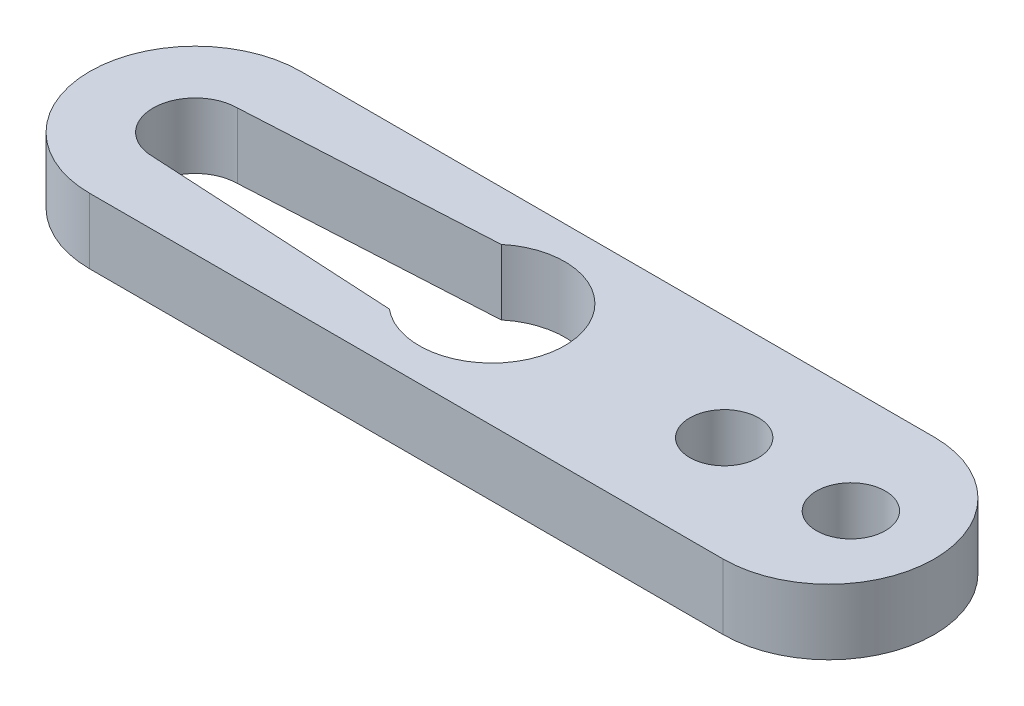
ISO-10303-21;
HEADER;
FILE_DESCRIPTION(('STEP AP214'),'2;1');
FILE_NAME('part.step','',(''),(''),'','','');
FILE_SCHEMA(('AUTOMOTIVE_DESIGN { 1 0 10303 214 1 1 1 1 }'));
ENDSEC;
DATA;
#1=APPLICATION_CONTEXT('core data for automotive mechanical design processes');
#2=APPLICATION_PROTOCOL_DEFINITION('international standard','automotive_design',2000,#1);
#3=PRODUCT_CONTEXT('',#1,'mechanical');
#4=PRODUCT('Part','Part','',(#3));
#5=PRODUCT_RELATED_PRODUCT_CATEGORY('part','',(#4));
#6=PRODUCT_DEFINITION_FORMATION('','',#4);
#7=PRODUCT_DEFINITION_CONTEXT('part definition',#1,'design');
#8=PRODUCT_DEFINITION('design','',#6,#7);
#9=PRODUCT_DEFINITION_SHAPE('','',#8);
#10=(LENGTH_UNIT() NAMED_UNIT(*) SI_UNIT(.MILLI.,.METRE.));
#11=(NAMED_UNIT(*) PLANE_ANGLE_UNIT() SI_UNIT($,.RADIAN.));
#12=(NAMED_UNIT(*) SI_UNIT($,.STERADIAN.) SOLID_ANGLE_UNIT());
#13=UNCERTAINTY_MEASURE_WITH_UNIT(LENGTH_MEASURE(1.E-05),#10,'distance_accuracy_value','');
#14=(GEOMETRIC_REPRESENTATION_CONTEXT(3) GLOBAL_UNCERTAINTY_ASSIGNED_CONTEXT((#13)) GLOBAL_UNIT_ASSIGNED_CONTEXT((#10,
#11,#12)) REPRESENTATION_CONTEXT('',''));
#15=CARTESIAN_POINT('',(0.,0.,0.));
#16=DIRECTION('',(0.,0.,1.));
#17=DIRECTION('',(1.,0.,0.));
#18=AXIS2_PLACEMENT_3D('',#15,#16,#17);
#19=CARTESIAN_POINT('',(-15.,-0.1,0.));
#20=DIRECTION('',(0.,1.,0.));
#21=DIRECTION('',(0.,0.,1.));
#22=AXIS2_PLACEMENT_3D('',#19,#20,#21);
#23=CYLINDRICAL_SURFACE('',#22,5.00000000000001);
#24=DIRECTION('',(0.,1.,0.));
#25=VECTOR('',#24,1.);
#26=CARTESIAN_POINT('',(-15.,-0.1,5.00000000000001));
#27=LINE('',#26,#25);
#28=CARTESIAN_POINT('',(-15.,-0.1,5.00000000000001));
#29=VERTEX_POINT('',#28);
#30=CARTESIAN_POINT('',(-15.,3.,5.00000000000001));
#31=VERTEX_POINT('',#30);
#32=EDGE_CURVE('E36',#29,#31,#27,.T.);
#33=ORIENTED_EDGE('',*,*,#32,.T.);
#34=CARTESIAN_POINT('',(-15.,3.,0.));
#35=DIRECTION('',(0.,1.,0.));
#36=DIRECTION('',(0.,0.,1.));
#37=AXIS2_PLACEMENT_3D('',#34,#35,#36);
#38=CIRCLE('',#37,5.00000000000001);
#39=CARTESIAN_POINT('',(-15.,3.,-5.00000000000001));
#40=VERTEX_POINT('',#39);
#41=EDGE_CURVE('E130',#40,#31,#38,.T.);
#42=ORIENTED_EDGE('',*,*,#41,.F.);
#43=DIRECTION('',(0.,1.,0.));
#44=VECTOR('',#43,1.);
#45=CARTESIAN_POINT('',(-15.,-0.1,-5.00000000000001));
#46=LINE('',#45,#44);
#47=CARTESIAN_POINT('',(-15.,-0.1,-5.00000000000001));
#48=VERTEX_POINT('',#47);
#49=EDGE_CURVE('E11',#48,#40,#46,.T.);
#50=ORIENTED_EDGE('',*,*,#49,.F.);
#51=CARTESIAN_POINT('',(-15.,-0.1,0.));
#52=DIRECTION('',(0.,1.,0.));
#53=DIRECTION('',(0.,0.,1.));
#54=AXIS2_PLACEMENT_3D('',#51,#52,#53);
#55=CIRCLE('',#54,5.00000000000001);
#56=EDGE_CURVE('E149',#48,#29,#55,.T.);
#57=ORIENTED_EDGE('',*,*,#56,.T.);
#58=EDGE_LOOP('',(#33,#42,#50,#57));
#59=FACE_BOUND('',#58,.T.);
#60=ADVANCED_FACE('F33',(#59),#23,.T.);
#61=CARTESIAN_POINT('',(-15.,-0.1,-5.00000000000001));
#62=DIRECTION('',(0.,0.,-1.));
#63=DIRECTION('',(-1.,0.,0.));
#64=AXIS2_PLACEMENT_3D('',#61,#62,#63);
#65=PLANE('',#64);
#66=ORIENTED_EDGE('',*,*,#49,.T.);
#67=DIRECTION('',(-1.,0.,0.));
#68=VECTOR('',#67,1.);
#69=CARTESIAN_POINT('',(-15.,3.,-5.00000000000001));
#70=LINE('',#69,#68);
#71=CARTESIAN_POINT('',(15.,3.,-5.00000000000001));
#72=VERTEX_POINT('',#71);
#73=EDGE_CURVE('E139',#72,#40,#70,.T.);
#74=ORIENTED_EDGE('',*,*,#73,.F.);
#75=DIRECTION('',(0.,1.,0.));
#76=VECTOR('',#75,1.);
#77=CARTESIAN_POINT('',(15.,-0.1,-5.00000000000001));
#78=LINE('',#77,#76);
#79=CARTESIAN_POINT('',(15.,-0.1,-5.00000000000001));
#80=VERTEX_POINT('',#79);
#81=EDGE_CURVE('E41',#80,#72,#78,.T.);
#82=ORIENTED_EDGE('',*,*,#81,.F.);
#83=DIRECTION('',(-1.,0.,0.));
#84=VECTOR('',#83,1.);
#85=CARTESIAN_POINT('',(-15.,-0.1,-5.00000000000001));
#86=LINE('',#85,#84);
#87=EDGE_CURVE('E160',#80,#48,#86,.T.);
#88=ORIENTED_EDGE('',*,*,#87,.T.);
#89=EDGE_LOOP('',(#66,#74,#82,#88));
#90=FACE_BOUND('',#89,.T.);
#91=ADVANCED_FACE('F172',(#90),#65,.T.);
#92=CARTESIAN_POINT('',(15.,-0.1,0.));
#93=DIRECTION('',(0.,1.,0.));
#94=DIRECTION('',(0.,0.,1.));
#95=AXIS2_PLACEMENT_3D('',#92,#93,#94);
#96=CYLINDRICAL_SURFACE('',#95,5.00000000000001);
#97=ORIENTED_EDGE('',*,*,#81,.T.);
#98=CARTESIAN_POINT('',(15.,3.,0.));
#99=DIRECTION('',(0.,1.,0.));
#100=DIRECTION('',(0.,0.,1.));
#101=AXIS2_PLACEMENT_3D('',#98,#99,#100);
#102=CIRCLE('',#101,5.00000000000001);
#103=CARTESIAN_POINT('',(15.,3.,5.));
#104=VERTEX_POINT('',#103);
#105=EDGE_CURVE('E136',#104,#72,#102,.T.);
#106=ORIENTED_EDGE('',*,*,#105,.F.);
#107=DIRECTION('',(0.,1.,0.));
#108=VECTOR('',#107,1.);
#109=CARTESIAN_POINT('',(15.,-0.1,5.));
#110=LINE('',#109,#108);
#111=CARTESIAN_POINT('',(15.,-0.1,5.));
#112=VERTEX_POINT('',#111);
#113=EDGE_CURVE('E163',#112,#104,#110,.T.);
#114=ORIENTED_EDGE('',*,*,#113,.F.);
#115=CARTESIAN_POINT('',(15.,-0.1,0.));
#116=DIRECTION('',(0.,1.,0.));
#117=DIRECTION('',(0.,0.,1.));
#118=AXIS2_PLACEMENT_3D('',#115,#116,#117);
#119=CIRCLE('',#118,5.00000000000001);
#120=EDGE_CURVE('E157',#112,#80,#119,.T.);
#121=ORIENTED_EDGE('',*,*,#120,.T.);
#122=EDGE_LOOP('',(#97,#106,#114,#121));
#123=FACE_BOUND('',#122,.T.);
#124=ADVANCED_FACE('F178',(#123),#96,.T.);
#125=CARTESIAN_POINT('',(-15.,-0.1,5.00000000000001));
#126=DIRECTION('',(0.,0.,1.));
#127=DIRECTION('',(1.,0.,0.));
#128=AXIS2_PLACEMENT_3D('',#125,#126,#127);
#129=PLANE('',#128);
#130=ORIENTED_EDGE('',*,*,#113,.T.);
#131=DIRECTION('',(1.,0.,0.));
#132=VECTOR('',#131,1.);
#133=CARTESIAN_POINT('',(-15.,3.,5.00000000000001));
#134=LINE('',#133,#132);
#135=EDGE_CURVE('E133',#31,#104,#134,.T.);
#136=ORIENTED_EDGE('',*,*,#135,.F.);
#137=ORIENTED_EDGE('',*,*,#32,.F.);
#138=DIRECTION('',(1.,0.,0.));
#139=VECTOR('',#138,1.);
#140=CARTESIAN_POINT('',(-15.,-0.1,5.00000000000001));
#141=LINE('',#140,#139);
#142=EDGE_CURVE('E154',#29,#112,#141,.T.);
#143=ORIENTED_EDGE('',*,*,#142,.T.);
#144=EDGE_LOOP('',(#130,#136,#137,#143));
#145=FACE_BOUND('',#144,.T.);
#146=ADVANCED_FACE('F167',(#145),#129,.T.);
#147=CARTESIAN_POINT('',(-15.,-0.1,0.));
#148=DIRECTION('',(0.,1.,0.));
#149=DIRECTION('',(0.,0.,1.));
#150=AXIS2_PLACEMENT_3D('',#147,#148,#149);
#151=PLANE('',#150);
#152=CARTESIAN_POINT('',(10.05,-0.0999999999999994,0.));
#153=DIRECTION('',(0.,1.,0.));
#154=DIRECTION('',(0.,0.,1.));
#155=AXIS2_PLACEMENT_3D('',#152,#153,#154);
#156=CIRCLE('',#155,1.63195);
#157=CARTESIAN_POINT('',(10.05,-0.0999999999999994,1.63195));
#158=VERTEX_POINT('',#157);
#159=EDGE_CURVE('E283',#158,#158,#156,.T.);
#160=ORIENTED_EDGE('',*,*,#159,.T.);
#161=EDGE_LOOP('',(#160));
#162=FACE_BOUND('',#161,.T.);
#163=CARTESIAN_POINT('',(16.05,-0.0999999999999994,0.));
#164=DIRECTION('',(0.,1.,0.));
#165=DIRECTION('',(0.,0.,1.));
#166=AXIS2_PLACEMENT_3D('',#163,#164,#165);
#167=CIRCLE('',#166,1.63195);
#168=CARTESIAN_POINT('',(16.05,-0.0999999999999994,1.63195));
#169=VERTEX_POINT('',#168);
#170=EDGE_CURVE('E119',#169,#169,#167,.T.);
#171=ORIENTED_EDGE('',*,*,#170,.T.);
#172=EDGE_LOOP('',(#171));
#173=FACE_BOUND('',#172,.T.);
#174=DIRECTION('',(-0.998496702368245,0.,0.0548118177014836));
#175=VECTOR('',#174,1.);
#176=CARTESIAN_POINT('',(-15.,-0.1,-2.));
#177=LINE('',#176,#175);
#178=CARTESIAN_POINT('',(-3.1590723072739,-0.1,-2.64999991344067));
#179=VERTEX_POINT('',#178);
#180=CARTESIAN_POINT('',(-15.,-0.1,-2.));
#181=VERTEX_POINT('',#180);
#182=EDGE_CURVE('E110',#179,#181,#177,.T.);
#183=ORIENTED_EDGE('',*,*,#182,.T.);
#184=CARTESIAN_POINT('',(-15.,-0.1,0.));
#185=DIRECTION('',(0.,1.,0.));
#186=DIRECTION('',(0.,0.,-1.));
#187=AXIS2_PLACEMENT_3D('',#184,#185,#186);
#188=CIRCLE('',#187,2.);
#189=CARTESIAN_POINT('',(-15.,-0.1,2.));
#190=VERTEX_POINT('',#189);
#191=EDGE_CURVE('E142',#181,#190,#188,.T.);
#192=ORIENTED_EDGE('',*,*,#191,.T.);
#193=DIRECTION('',(0.998496702368245,0.,0.0548118177014836));
#194=VECTOR('',#193,1.);
#195=CARTESIAN_POINT('',(-15.,-0.1,2.));
#196=LINE('',#195,#194);
#197=CARTESIAN_POINT('',(-3.15907230727391,-0.1,2.64999991344067));
#198=VERTEX_POINT('',#197);
#199=EDGE_CURVE('E105',#190,#198,#196,.T.);
#200=ORIENTED_EDGE('',*,*,#199,.T.);
#201=CARTESIAN_POINT('',(-0.95,-0.1,0.));
#202=DIRECTION('',(0.,1.,0.));
#203=DIRECTION('',(0.,0.,1.));
#204=AXIS2_PLACEMENT_3D('',#201,#202,#203);
#205=CIRCLE('',#204,3.45);
#206=EDGE_CURVE('E49',#198,#179,#205,.T.);
#207=ORIENTED_EDGE('',*,*,#206,.T.);
#208=EDGE_LOOP('',(#183,#192,#200,#207));
#209=FACE_BOUND('',#208,.T.);
#210=ORIENTED_EDGE('',*,*,#56,.F.);
#211=ORIENTED_EDGE('',*,*,#87,.F.);
#212=ORIENTED_EDGE('',*,*,#120,.F.);
#213=ORIENTED_EDGE('',*,*,#142,.F.);
#214=EDGE_LOOP('',(#210,#211,#212,#213));
#215=FACE_BOUND('',#214,.T.);
#216=ADVANCED_FACE('F176',(#162,#173,#209,#215),#151,.F.);
#217=CARTESIAN_POINT('',(-15.,-0.1,0.));
#218=DIRECTION('',(0.,1.,0.));
#219=DIRECTION('',(0.,0.,1.));
#220=AXIS2_PLACEMENT_3D('',#217,#218,#219);
#221=CYLINDRICAL_SURFACE('',#220,2.);
#222=DIRECTION('',(0.,1.,0.));
#223=VECTOR('',#222,1.);
#224=CARTESIAN_POINT('',(-15.,-0.1,-2.));
#225=LINE('',#224,#223);
#226=CARTESIAN_POINT('',(-15.,3.,-2.));
#227=VERTEX_POINT('',#226);
#228=EDGE_CURVE('E115',#181,#227,#225,.T.);
#229=ORIENTED_EDGE('',*,*,#228,.T.);
#230=CARTESIAN_POINT('',(-15.,3.,0.));
#231=DIRECTION('',(0.,1.,0.));
#232=DIRECTION('',(0.,0.,-1.));
#233=AXIS2_PLACEMENT_3D('',#230,#231,#232);
#234=CIRCLE('',#233,2.);
#235=CARTESIAN_POINT('',(-15.,3.,2.));
#236=VERTEX_POINT('',#235);
#237=EDGE_CURVE('E113',#227,#236,#234,.T.);
#238=ORIENTED_EDGE('',*,*,#237,.T.);
#239=DIRECTION('',(0.,1.,0.));
#240=VECTOR('',#239,1.);
#241=CARTESIAN_POINT('',(-15.,-0.1,2.));
#242=LINE('',#241,#240);
#243=EDGE_CURVE('E98',#190,#236,#242,.T.);
#244=ORIENTED_EDGE('',*,*,#243,.F.);
#245=ORIENTED_EDGE('',*,*,#191,.F.);
#246=EDGE_LOOP('',(#229,#238,#244,#245));
#247=FACE_BOUND('',#246,.T.);
#248=ADVANCED_FACE('F114',(#247),#221,.F.);
#249=CARTESIAN_POINT('',(-15.,-0.1,-2.));
#250=DIRECTION('',(-0.0548118177014836,0.,-0.998496702368245));
#251=DIRECTION('',(-0.998496702368245,0.,0.0548118177014836));
#252=AXIS2_PLACEMENT_3D('',#249,#250,#251);
#253=PLANE('',#252);
#254=DIRECTION('',(0.,1.,0.));
#255=VECTOR('',#254,1.);
#256=CARTESIAN_POINT('',(-3.1590723072739,-0.1,-2.64999991344067));
#257=LINE('',#256,#255);
#258=CARTESIAN_POINT('',(-3.1590723072739,3.,-2.64999991344067));
#259=VERTEX_POINT('',#258);
#260=EDGE_CURVE('E150',#179,#259,#257,.T.);
#261=ORIENTED_EDGE('',*,*,#260,.T.);
#262=DIRECTION('',(-0.998496702368245,0.,0.0548118177014836));
#263=VECTOR('',#262,1.);
#264=CARTESIAN_POINT('',(-15.,3.,-2.));
#265=LINE('',#264,#263);
#266=EDGE_CURVE('E125',#259,#227,#265,.T.);
#267=ORIENTED_EDGE('',*,*,#266,.T.);
#268=ORIENTED_EDGE('',*,*,#228,.F.);
#269=ORIENTED_EDGE('',*,*,#182,.F.);
#270=EDGE_LOOP('',(#261,#267,#268,#269));
#271=FACE_BOUND('',#270,.T.);
#272=ADVANCED_FACE('F214',(#271),#253,.F.);
#273=CARTESIAN_POINT('',(-0.95,-0.1,0.));
#274=DIRECTION('',(0.,1.,0.));
#275=DIRECTION('',(0.,0.,1.));
#276=AXIS2_PLACEMENT_3D('',#273,#274,#275);
#277=CYLINDRICAL_SURFACE('',#276,3.45);
#278=DIRECTION('',(0.,1.,0.));
#279=VECTOR('',#278,1.);
#280=CARTESIAN_POINT('',(-3.1590723072739,-0.1,2.64999991344067));
#281=LINE('',#280,#279);
#282=CARTESIAN_POINT('',(-3.1590723072739,3.,2.64999991344067));
#283=VERTEX_POINT('',#282);
#284=EDGE_CURVE('E109',#198,#283,#281,.T.);
#285=ORIENTED_EDGE('',*,*,#284,.T.);
#286=CARTESIAN_POINT('',(-0.95,3.,0.));
#287=DIRECTION('',(0.,1.,0.));
#288=DIRECTION('',(0.,0.,1.));
#289=AXIS2_PLACEMENT_3D('',#286,#287,#288);
#290=CIRCLE('',#289,3.45);
#291=EDGE_CURVE('E123',#283,#259,#290,.T.);
#292=ORIENTED_EDGE('',*,*,#291,.T.);
#293=ORIENTED_EDGE('',*,*,#260,.F.);
#294=ORIENTED_EDGE('',*,*,#206,.F.);
#295=EDGE_LOOP('',(#285,#292,#293,#294));
#296=FACE_BOUND('',#295,.T.);
#297=ADVANCED_FACE('F223',(#296),#277,.F.);
#298=CARTESIAN_POINT('',(-15.,-0.1,2.));
#299=DIRECTION('',(-0.0548118177014836,0.,0.998496702368245));
#300=DIRECTION('',(0.998496702368245,0.,0.0548118177014836));
#301=AXIS2_PLACEMENT_3D('',#298,#299,#300);
#302=PLANE('',#301);
#303=ORIENTED_EDGE('',*,*,#243,.T.);
#304=DIRECTION('',(0.998496702368245,0.,0.0548118177014836));
#305=VECTOR('',#304,1.);
#306=CARTESIAN_POINT('',(-15.,3.,2.));
#307=LINE('',#306,#305);
#308=EDGE_CURVE('E102',#236,#283,#307,.T.);
#309=ORIENTED_EDGE('',*,*,#308,.T.);
#310=ORIENTED_EDGE('',*,*,#284,.F.);
#311=ORIENTED_EDGE('',*,*,#199,.F.);
#312=EDGE_LOOP('',(#303,#309,#310,#311));
#313=FACE_BOUND('',#312,.T.);
#314=ADVANCED_FACE('F100',(#313),#302,.F.);
#315=CARTESIAN_POINT('',(-15.,3.,0.));
#316=DIRECTION('',(0.,1.,0.));
#317=DIRECTION('',(0.,0.,1.));
#318=AXIS2_PLACEMENT_3D('',#315,#316,#317);
#319=PLANE('',#318);
#320=CARTESIAN_POINT('',(10.05,3.,0.));
#321=DIRECTION('',(0.,1.,0.));
#322=DIRECTION('',(0.,0.,1.));
#323=AXIS2_PLACEMENT_3D('',#320,#321,#322);
#324=CIRCLE('',#323,1.63195);
#325=CARTESIAN_POINT('',(10.05,3.,1.63195));
#326=VERTEX_POINT('',#325);
#327=EDGE_CURVE('E286',#326,#326,#324,.T.);
#328=ORIENTED_EDGE('',*,*,#327,.F.);
#329=EDGE_LOOP('',(#328));
#330=FACE_BOUND('',#329,.T.);
#331=CARTESIAN_POINT('',(16.05,3.,0.));
#332=DIRECTION('',(0.,1.,0.));
#333=DIRECTION('',(0.,0.,1.));
#334=AXIS2_PLACEMENT_3D('',#331,#332,#333);
#335=CIRCLE('',#334,1.63195);
#336=CARTESIAN_POINT('',(16.05,3.,1.63195));
#337=VERTEX_POINT('',#336);
#338=EDGE_CURVE('E288',#337,#337,#335,.T.);
#339=ORIENTED_EDGE('',*,*,#338,.F.);
#340=EDGE_LOOP('',(#339));
#341=FACE_BOUND('',#340,.T.);
#342=ORIENTED_EDGE('',*,*,#41,.T.);
#343=ORIENTED_EDGE('',*,*,#135,.T.);
#344=ORIENTED_EDGE('',*,*,#105,.T.);
#345=ORIENTED_EDGE('',*,*,#73,.T.);
#346=EDGE_LOOP('',(#342,#343,#344,#345));
#347=FACE_BOUND('',#346,.T.);
#348=ORIENTED_EDGE('',*,*,#308,.F.);
#349=ORIENTED_EDGE('',*,*,#237,.F.);
#350=ORIENTED_EDGE('',*,*,#266,.F.);
#351=ORIENTED_EDGE('',*,*,#291,.F.);
#352=EDGE_LOOP('',(#348,#349,#350,#351));
#353=FACE_BOUND('',#352,.T.);
#354=ADVANCED_FACE('F121',(#330,#341,#347,#353),#319,.T.);
#355=CARTESIAN_POINT('',(16.05,3.,0.));
#356=DIRECTION('',(0.,1.,0.));
#357=DIRECTION('',(0.,0.,1.));
#358=AXIS2_PLACEMENT_3D('',#355,#356,#357);
#359=CYLINDRICAL_SURFACE('',#358,1.63195);
#360=ORIENTED_EDGE('',*,*,#170,.F.);
#361=EDGE_LOOP('',(#360));
#362=FACE_BOUND('',#361,.T.);
#363=ORIENTED_EDGE('',*,*,#338,.T.);
#364=EDGE_LOOP('',(#363));
#365=FACE_BOUND('',#364,.T.);
#366=ADVANCED_FACE('F256',(#362,#365),#359,.F.);
#367=CARTESIAN_POINT('',(10.05,3.,0.));
#368=DIRECTION('',(0.,1.,0.));
#369=DIRECTION('',(0.,0.,1.));
#370=AXIS2_PLACEMENT_3D('',#367,#368,#369);
#371=CYLINDRICAL_SURFACE('',#370,1.63195);
#372=ORIENTED_EDGE('',*,*,#159,.F.);
#373=EDGE_LOOP('',(#372));
#374=FACE_BOUND('',#373,.T.);
#375=ORIENTED_EDGE('',*,*,#327,.T.);
#376=EDGE_LOOP('',(#375));
#377=FACE_BOUND('',#376,.T.);
#378=ADVANCED_FACE('F266',(#374,#377),#371,.F.);
#379=CLOSED_SHELL('',(#60,#91,#124,#146,#216,#248,#272,#297,#314,#354,#366,#378));
#380=MANIFOLD_SOLID_BREP('B2',#379);
#381=ADVANCED_BREP_SHAPE_REPRESENTATION('',(#18,#380),#14);
#382=SHAPE_DEFINITION_REPRESENTATION(#9,#381);
ENDSEC;
END-ISO-10303-21;
